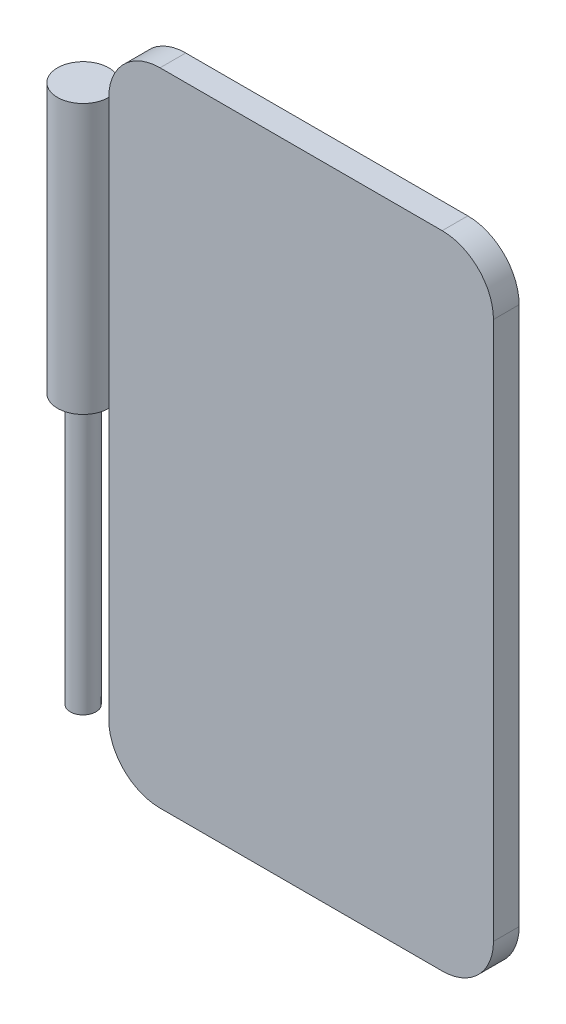
ISO-10303-21;
HEADER;
FILE_DESCRIPTION(('STEP AP214'),'2;1');
FILE_NAME('part.step','',(''),(''),'','','');
FILE_SCHEMA(('AUTOMOTIVE_DESIGN { 1 0 10303 214 1 1 1 1 }'));
ENDSEC;
DATA;
#1=APPLICATION_CONTEXT('core data for automotive mechanical design processes');
#2=APPLICATION_PROTOCOL_DEFINITION('international standard','automotive_design',2000,#1);
#3=PRODUCT_CONTEXT('',#1,'mechanical');
#4=PRODUCT('Part','Part','',(#3));
#5=PRODUCT_RELATED_PRODUCT_CATEGORY('part','',(#4));
#6=PRODUCT_DEFINITION_FORMATION('','',#4);
#7=PRODUCT_DEFINITION_CONTEXT('part definition',#1,'design');
#8=PRODUCT_DEFINITION('design','',#6,#7);
#9=PRODUCT_DEFINITION_SHAPE('','',#8);
#10=(LENGTH_UNIT() NAMED_UNIT(*) SI_UNIT(.MILLI.,.METRE.));
#11=(NAMED_UNIT(*) PLANE_ANGLE_UNIT() SI_UNIT($,.RADIAN.));
#12=(NAMED_UNIT(*) SI_UNIT($,.STERADIAN.) SOLID_ANGLE_UNIT());
#13=UNCERTAINTY_MEASURE_WITH_UNIT(LENGTH_MEASURE(1.E-05),#10,'distance_accuracy_value','');
#14=(GEOMETRIC_REPRESENTATION_CONTEXT(3) GLOBAL_UNCERTAINTY_ASSIGNED_CONTEXT((#13)) GLOBAL_UNIT_ASSIGNED_CONTEXT((#10,
#11,#12)) REPRESENTATION_CONTEXT('',''));
#15=CARTESIAN_POINT('',(0.,0.,0.));
#16=DIRECTION('',(0.,0.,1.));
#17=DIRECTION('',(1.,0.,0.));
#18=AXIS2_PLACEMENT_3D('',#15,#16,#17);
#19=CARTESIAN_POINT('',(0.,-6.87500000000001,0.5));
#20=DIRECTION('',(0.,1.,0.));
#21=DIRECTION('',(-1.,0.,0.));
#22=AXIS2_PLACEMENT_3D('',#19,#20,#21);
#23=PLANE('',#22);
#24=CARTESIAN_POINT('',(3.75,-6.87500000000001,0.5));
#25=DIRECTION('',(0.,1.,0.));
#26=DIRECTION('',(-1.,0.,0.));
#27=AXIS2_PLACEMENT_3D('',#24,#25,#26);
#28=CIRCLE('',#27,0.5);
#29=CARTESIAN_POINT('',(3.25,-6.87500000000001,0.5));
#30=VERTEX_POINT('',#29);
#31=EDGE_CURVE('E11',#30,#30,#28,.T.);
#32=ORIENTED_EDGE('',*,*,#31,.F.);
#33=EDGE_LOOP('',(#32));
#34=FACE_BOUND('',#33,.T.);
#35=ADVANCED_FACE('F53',(#34),#23,.F.);
#36=CARTESIAN_POINT('',(3.75,14.125,0.5));
#37=DIRECTION('',(0.,1.,0.));
#38=DIRECTION('',(-1.,0.,0.));
#39=AXIS2_PLACEMENT_3D('',#36,#37,#38);
#40=CYLINDRICAL_SURFACE('',#39,0.5);
#41=ORIENTED_EDGE('',*,*,#31,.T.);
#42=EDGE_LOOP('',(#41));
#43=FACE_BOUND('',#42,.T.);
#44=CARTESIAN_POINT('',(3.75,3.62499999999999,0.5));
#45=DIRECTION('',(0.,1.,0.));
#46=DIRECTION('',(-1.,0.,0.));
#47=AXIS2_PLACEMENT_3D('',#44,#45,#46);
#48=CIRCLE('',#47,0.5);
#49=CARTESIAN_POINT('',(3.25,3.62499999999999,0.5));
#50=VERTEX_POINT('',#49);
#51=EDGE_CURVE('E59',#50,#50,#48,.T.);
#52=ORIENTED_EDGE('',*,*,#51,.F.);
#53=EDGE_LOOP('',(#52));
#54=FACE_BOUND('',#53,.T.);
#55=ADVANCED_FACE('F85',(#43,#54),#40,.T.);
#56=CARTESIAN_POINT('',(0.,3.62499999999999,0.5));
#57=DIRECTION('',(0.,1.,0.));
#58=DIRECTION('',(-1.,0.,0.));
#59=AXIS2_PLACEMENT_3D('',#56,#57,#58);
#60=PLANE('',#59);
#61=CARTESIAN_POINT('',(3.75,3.62499999999999,0.5));
#62=DIRECTION('',(0.,1.,0.));
#63=DIRECTION('',(-1.,0.,0.));
#64=AXIS2_PLACEMENT_3D('',#61,#62,#63);
#65=CIRCLE('',#64,0.999999999999998);
#66=CARTESIAN_POINT('',(2.75,3.62499999999999,0.5));
#67=VERTEX_POINT('',#66);
#68=EDGE_CURVE('E63',#67,#67,#65,.T.);
#69=ORIENTED_EDGE('',*,*,#68,.F.);
#70=EDGE_LOOP('',(#69));
#71=FACE_BOUND('',#70,.T.);
#72=ORIENTED_EDGE('',*,*,#51,.T.);
#73=EDGE_LOOP('',(#72));
#74=FACE_BOUND('',#73,.T.);
#75=ADVANCED_FACE('F77',(#71,#74),#60,.F.);
#76=CARTESIAN_POINT('',(3.75,14.125,0.5));
#77=DIRECTION('',(0.,1.,0.));
#78=DIRECTION('',(-1.,0.,0.));
#79=AXIS2_PLACEMENT_3D('',#76,#77,#78);
#80=CYLINDRICAL_SURFACE('',#79,0.999999999999999);
#81=ORIENTED_EDGE('',*,*,#68,.T.);
#82=EDGE_LOOP('',(#81));
#83=FACE_BOUND('',#82,.T.);
#84=CARTESIAN_POINT('',(3.75,14.125,0.5));
#85=DIRECTION('',(0.,1.,0.));
#86=DIRECTION('',(-1.,0.,0.));
#87=AXIS2_PLACEMENT_3D('',#84,#85,#86);
#88=CIRCLE('',#87,1.);
#89=CARTESIAN_POINT('',(2.75,14.125,0.5));
#90=VERTEX_POINT('',#89);
#91=EDGE_CURVE('E67',#90,#90,#88,.T.);
#92=ORIENTED_EDGE('',*,*,#91,.F.);
#93=EDGE_LOOP('',(#92));
#94=FACE_BOUND('',#93,.T.);
#95=ADVANCED_FACE('F75',(#83,#94),#80,.T.);
#96=CARTESIAN_POINT('',(0.,14.125,0.5));
#97=DIRECTION('',(0.,1.,0.));
#98=DIRECTION('',(-1.,0.,0.));
#99=AXIS2_PLACEMENT_3D('',#96,#97,#98);
#100=PLANE('',#99);
#101=ORIENTED_EDGE('',*,*,#91,.T.);
#102=EDGE_LOOP('',(#101));
#103=FACE_BOUND('',#102,.T.);
#104=ADVANCED_FACE('F73',(#103),#100,.T.);
#105=CLOSED_SHELL('',(#35,#55,#75,#95,#104));
#106=MANIFOLD_SOLID_BREP('B2',#105);
#107=CARTESIAN_POINT('',(6.75,-6.87500000000001,0.5));
#108=DIRECTION('',(0.,0.,-1.));
#109=DIRECTION('',(-1.,0.,0.));
#110=AXIS2_PLACEMENT_3D('',#107,#108,#109);
#111=CYLINDRICAL_SURFACE('',#110,2.);
#112=CARTESIAN_POINT('',(6.75,-6.87500000000001,-0.5));
#113=DIRECTION('',(0.,0.,1.));
#114=DIRECTION('',(1.,0.,0.));
#115=AXIS2_PLACEMENT_3D('',#112,#113,#114);
#116=CIRCLE('',#115,2.);
#117=CARTESIAN_POINT('',(4.75,-6.875,-0.5));
#118=VERTEX_POINT('',#117);
#119=CARTESIAN_POINT('',(6.75000000000001,-8.87500000000001,-0.5));
#120=VERTEX_POINT('',#119);
#121=EDGE_CURVE('E241',#118,#120,#116,.T.);
#122=ORIENTED_EDGE('',*,*,#121,.T.);
#123=DIRECTION('',(0.,0.,-1.));
#124=VECTOR('',#123,1.);
#125=CARTESIAN_POINT('',(6.75000000000001,-8.87500000000001,0.5));
#126=LINE('',#125,#124);
#127=CARTESIAN_POINT('',(6.75000000000001,-8.87500000000001,0.5));
#128=VERTEX_POINT('',#127);
#129=EDGE_CURVE('E51',#128,#120,#126,.T.);
#130=ORIENTED_EDGE('',*,*,#129,.F.);
#131=CARTESIAN_POINT('',(6.75,-6.87500000000001,0.5));
#132=DIRECTION('',(0.,0.,1.));
#133=DIRECTION('',(1.,0.,0.));
#134=AXIS2_PLACEMENT_3D('',#131,#132,#133);
#135=CIRCLE('',#134,2.);
#136=CARTESIAN_POINT('',(4.75,-6.875,0.5));
#137=VERTEX_POINT('',#136);
#138=EDGE_CURVE('E263',#137,#128,#135,.T.);
#139=ORIENTED_EDGE('',*,*,#138,.F.);
#140=DIRECTION('',(0.,0.,-1.));
#141=VECTOR('',#140,1.);
#142=CARTESIAN_POINT('',(4.75,-6.875,0.5));
#143=LINE('',#142,#141);
#144=EDGE_CURVE('E237',#137,#118,#143,.T.);
#145=ORIENTED_EDGE('',*,*,#144,.T.);
#146=EDGE_LOOP('',(#122,#130,#139,#145));
#147=FACE_BOUND('',#146,.T.);
#148=ADVANCED_FACE('F140',(#147),#111,.T.);
#149=CARTESIAN_POINT('',(17.75,-8.87500000000001,0.5));
#150=DIRECTION('',(0.,1.,0.));
#151=DIRECTION('',(-1.,0.,0.));
#152=AXIS2_PLACEMENT_3D('',#149,#150,#151);
#153=PLANE('',#152);
#154=DIRECTION('',(1.,0.,0.));
#155=VECTOR('',#154,1.);
#156=CARTESIAN_POINT('',(17.75,-8.87500000000001,-0.5));
#157=LINE('',#156,#155);
#158=CARTESIAN_POINT('',(17.75,-8.87500000000001,-0.5));
#159=VERTEX_POINT('',#158);
#160=EDGE_CURVE('E245',#120,#159,#157,.T.);
#161=ORIENTED_EDGE('',*,*,#160,.T.);
#162=DIRECTION('',(0.,0.,-1.));
#163=VECTOR('',#162,1.);
#164=CARTESIAN_POINT('',(17.75,-8.87500000000001,0.5));
#165=LINE('',#164,#163);
#166=CARTESIAN_POINT('',(17.75,-8.87500000000001,0.5));
#167=VERTEX_POINT('',#166);
#168=EDGE_CURVE('E149',#167,#159,#165,.T.);
#169=ORIENTED_EDGE('',*,*,#168,.F.);
#170=DIRECTION('',(1.,0.,0.));
#171=VECTOR('',#170,1.);
#172=CARTESIAN_POINT('',(17.75,-8.87500000000001,0.5));
#173=LINE('',#172,#171);
#174=EDGE_CURVE('E200',#128,#167,#173,.T.);
#175=ORIENTED_EDGE('',*,*,#174,.F.);
#176=ORIENTED_EDGE('',*,*,#129,.T.);
#177=EDGE_LOOP('',(#161,#169,#175,#176));
#178=FACE_BOUND('',#177,.T.);
#179=ADVANCED_FACE('F309',(#178),#153,.F.);
#180=CARTESIAN_POINT('',(17.75,-6.87500000000001,0.5));
#181=DIRECTION('',(0.,0.,-1.));
#182=DIRECTION('',(-1.,0.,0.));
#183=AXIS2_PLACEMENT_3D('',#180,#181,#182);
#184=CYLINDRICAL_SURFACE('',#183,2.);
#185=CARTESIAN_POINT('',(17.75,-6.87500000000001,-0.5));
#186=DIRECTION('',(0.,0.,1.));
#187=DIRECTION('',(1.,0.,0.));
#188=AXIS2_PLACEMENT_3D('',#185,#186,#187);
#189=CIRCLE('',#188,2.);
#190=CARTESIAN_POINT('',(19.75,-6.875,-0.5));
#191=VERTEX_POINT('',#190);
#192=EDGE_CURVE('E248',#159,#191,#189,.T.);
#193=ORIENTED_EDGE('',*,*,#192,.T.);
#194=DIRECTION('',(0.,0.,-1.));
#195=VECTOR('',#194,1.);
#196=CARTESIAN_POINT('',(19.75,-6.875,0.5));
#197=LINE('',#196,#195);
#198=CARTESIAN_POINT('',(19.75,-6.875,0.5));
#199=VERTEX_POINT('',#198);
#200=EDGE_CURVE('E274',#199,#191,#197,.T.);
#201=ORIENTED_EDGE('',*,*,#200,.F.);
#202=CARTESIAN_POINT('',(17.75,-6.87500000000001,0.5));
#203=DIRECTION('',(0.,0.,1.));
#204=DIRECTION('',(1.,0.,0.));
#205=AXIS2_PLACEMENT_3D('',#202,#203,#204);
#206=CIRCLE('',#205,2.);
#207=EDGE_CURVE('E284',#167,#199,#206,.T.);
#208=ORIENTED_EDGE('',*,*,#207,.F.);
#209=ORIENTED_EDGE('',*,*,#168,.T.);
#210=EDGE_LOOP('',(#193,#201,#208,#209));
#211=FACE_BOUND('',#210,.T.);
#212=ADVANCED_FACE('F282',(#211),#184,.T.);
#213=CARTESIAN_POINT('',(19.75,-6.875,0.5));
#214=DIRECTION('',(-1.,0.,0.));
#215=DIRECTION('',(0.,0.,1.));
#216=AXIS2_PLACEMENT_3D('',#213,#214,#215);
#217=PLANE('',#216);
#218=DIRECTION('',(0.,1.,0.));
#219=VECTOR('',#218,1.);
#220=CARTESIAN_POINT('',(19.75,-6.875,-0.5));
#221=LINE('',#220,#219);
#222=CARTESIAN_POINT('',(19.75,14.125,-0.5));
#223=VERTEX_POINT('',#222);
#224=EDGE_CURVE('E251',#191,#223,#221,.T.);
#225=ORIENTED_EDGE('',*,*,#224,.T.);
#226=DIRECTION('',(0.,0.,-1.));
#227=VECTOR('',#226,1.);
#228=CARTESIAN_POINT('',(19.75,14.125,0.5));
#229=LINE('',#228,#227);
#230=CARTESIAN_POINT('',(19.75,14.125,0.5));
#231=VERTEX_POINT('',#230);
#232=EDGE_CURVE('E270',#231,#223,#229,.T.);
#233=ORIENTED_EDGE('',*,*,#232,.F.);
#234=DIRECTION('',(0.,1.,0.));
#235=VECTOR('',#234,1.);
#236=CARTESIAN_POINT('',(19.75,-6.875,0.5));
#237=LINE('',#236,#235);
#238=EDGE_CURVE('E297',#199,#231,#237,.T.);
#239=ORIENTED_EDGE('',*,*,#238,.F.);
#240=ORIENTED_EDGE('',*,*,#200,.T.);
#241=EDGE_LOOP('',(#225,#233,#239,#240));
#242=FACE_BOUND('',#241,.T.);
#243=ADVANCED_FACE('F292',(#242),#217,.F.);
#244=CARTESIAN_POINT('',(17.75,14.125,0.5));
#245=DIRECTION('',(0.,0.,-1.));
#246=DIRECTION('',(-1.,0.,0.));
#247=AXIS2_PLACEMENT_3D('',#244,#245,#246);
#248=CYLINDRICAL_SURFACE('',#247,2.);
#249=CARTESIAN_POINT('',(17.75,14.125,-0.5));
#250=DIRECTION('',(0.,0.,1.));
#251=DIRECTION('',(1.,0.,0.));
#252=AXIS2_PLACEMENT_3D('',#249,#250,#251);
#253=CIRCLE('',#252,2.);
#254=CARTESIAN_POINT('',(17.75,16.125,-0.5));
#255=VERTEX_POINT('',#254);
#256=EDGE_CURVE('E254',#223,#255,#253,.T.);
#257=ORIENTED_EDGE('',*,*,#256,.T.);
#258=DIRECTION('',(0.,0.,-1.));
#259=VECTOR('',#258,1.);
#260=CARTESIAN_POINT('',(17.75,16.125,0.5));
#261=LINE('',#260,#259);
#262=CARTESIAN_POINT('',(17.75,16.125,0.5));
#263=VERTEX_POINT('',#262);
#264=EDGE_CURVE('E230',#263,#255,#261,.T.);
#265=ORIENTED_EDGE('',*,*,#264,.F.);
#266=CARTESIAN_POINT('',(17.75,14.125,0.5));
#267=DIRECTION('',(0.,0.,1.));
#268=DIRECTION('',(1.,0.,0.));
#269=AXIS2_PLACEMENT_3D('',#266,#267,#268);
#270=CIRCLE('',#269,2.);
#271=EDGE_CURVE('E219',#231,#263,#270,.T.);
#272=ORIENTED_EDGE('',*,*,#271,.F.);
#273=ORIENTED_EDGE('',*,*,#232,.T.);
#274=EDGE_LOOP('',(#257,#265,#272,#273));
#275=FACE_BOUND('',#274,.T.);
#276=ADVANCED_FACE('F295',(#275),#248,.T.);
#277=CARTESIAN_POINT('',(17.75,16.125,0.5));
#278=DIRECTION('',(0.,-1.,0.));
#279=DIRECTION('',(1.,0.,0.));
#280=AXIS2_PLACEMENT_3D('',#277,#278,#279);
#281=PLANE('',#280);
#282=DIRECTION('',(-1.,0.,0.));
#283=VECTOR('',#282,1.);
#284=CARTESIAN_POINT('',(17.75,16.125,-0.5));
#285=LINE('',#284,#283);
#286=CARTESIAN_POINT('',(6.75000000000001,16.125,-0.5));
#287=VERTEX_POINT('',#286);
#288=EDGE_CURVE('E228',#255,#287,#285,.T.);
#289=ORIENTED_EDGE('',*,*,#288,.T.);
#290=DIRECTION('',(0.,0.,-1.));
#291=VECTOR('',#290,1.);
#292=CARTESIAN_POINT('',(6.75000000000001,16.125,0.5));
#293=LINE('',#292,#291);
#294=CARTESIAN_POINT('',(6.75000000000001,16.125,0.5));
#295=VERTEX_POINT('',#294);
#296=EDGE_CURVE('E225',#295,#287,#293,.T.);
#297=ORIENTED_EDGE('',*,*,#296,.F.);
#298=DIRECTION('',(-1.,0.,0.));
#299=VECTOR('',#298,1.);
#300=CARTESIAN_POINT('',(17.75,16.125,0.5));
#301=LINE('',#300,#299);
#302=EDGE_CURVE('E213',#263,#295,#301,.T.);
#303=ORIENTED_EDGE('',*,*,#302,.F.);
#304=ORIENTED_EDGE('',*,*,#264,.T.);
#305=EDGE_LOOP('',(#289,#297,#303,#304));
#306=FACE_BOUND('',#305,.T.);
#307=ADVANCED_FACE('F226',(#306),#281,.F.);
#308=CARTESIAN_POINT('',(6.75,14.125,0.5));
#309=DIRECTION('',(0.,0.,-1.));
#310=DIRECTION('',(-1.,0.,0.));
#311=AXIS2_PLACEMENT_3D('',#308,#309,#310);
#312=CYLINDRICAL_SURFACE('',#311,2.);
#313=CARTESIAN_POINT('',(6.75,14.125,-0.5));
#314=DIRECTION('',(0.,0.,1.));
#315=DIRECTION('',(-1.,0.,0.));
#316=AXIS2_PLACEMENT_3D('',#313,#314,#315);
#317=CIRCLE('',#316,2.);
#318=CARTESIAN_POINT('',(4.75,14.125,-0.5));
#319=VERTEX_POINT('',#318);
#320=EDGE_CURVE('E186',#287,#319,#317,.T.);
#321=ORIENTED_EDGE('',*,*,#320,.T.);
#322=DIRECTION('',(0.,0.,-1.));
#323=VECTOR('',#322,1.);
#324=CARTESIAN_POINT('',(4.75,14.125,0.5));
#325=LINE('',#324,#323);
#326=CARTESIAN_POINT('',(4.75,14.125,0.5));
#327=VERTEX_POINT('',#326);
#328=EDGE_CURVE('E231',#327,#319,#325,.T.);
#329=ORIENTED_EDGE('',*,*,#328,.F.);
#330=CARTESIAN_POINT('',(6.75,14.125,0.5));
#331=DIRECTION('',(0.,0.,1.));
#332=DIRECTION('',(-1.,0.,0.));
#333=AXIS2_PLACEMENT_3D('',#330,#331,#332);
#334=CIRCLE('',#333,2.);
#335=EDGE_CURVE('E217',#295,#327,#334,.T.);
#336=ORIENTED_EDGE('',*,*,#335,.F.);
#337=ORIENTED_EDGE('',*,*,#296,.T.);
#338=EDGE_LOOP('',(#321,#329,#336,#337));
#339=FACE_BOUND('',#338,.T.);
#340=ADVANCED_FACE('F233',(#339),#312,.T.);
#341=CARTESIAN_POINT('',(4.75,-6.875,0.5));
#342=DIRECTION('',(1.,0.,0.));
#343=DIRECTION('',(0.,0.,-1.));
#344=AXIS2_PLACEMENT_3D('',#341,#342,#343);
#345=PLANE('',#344);
#346=DIRECTION('',(0.,-1.,0.));
#347=VECTOR('',#346,1.);
#348=CARTESIAN_POINT('',(4.75,-6.875,-0.5));
#349=LINE('',#348,#347);
#350=EDGE_CURVE('E192',#319,#118,#349,.T.);
#351=ORIENTED_EDGE('',*,*,#350,.T.);
#352=ORIENTED_EDGE('',*,*,#144,.F.);
#353=DIRECTION('',(0.,-1.,0.));
#354=VECTOR('',#353,1.);
#355=CARTESIAN_POINT('',(4.75,-6.875,0.5));
#356=LINE('',#355,#354);
#357=EDGE_CURVE('E157',#327,#137,#356,.T.);
#358=ORIENTED_EDGE('',*,*,#357,.F.);
#359=ORIENTED_EDGE('',*,*,#328,.T.);
#360=EDGE_LOOP('',(#351,#352,#358,#359));
#361=FACE_BOUND('',#360,.T.);
#362=ADVANCED_FACE('F325',(#361),#345,.F.);
#363=CARTESIAN_POINT('',(6.75,-6.87500000000001,0.5));
#364=DIRECTION('',(0.,0.,1.));
#365=DIRECTION('',(1.,0.,0.));
#366=AXIS2_PLACEMENT_3D('',#363,#364,#365);
#367=PLANE('',#366);
#368=ORIENTED_EDGE('',*,*,#138,.T.);
#369=ORIENTED_EDGE('',*,*,#174,.T.);
#370=ORIENTED_EDGE('',*,*,#207,.T.);
#371=ORIENTED_EDGE('',*,*,#238,.T.);
#372=ORIENTED_EDGE('',*,*,#271,.T.);
#373=ORIENTED_EDGE('',*,*,#302,.T.);
#374=ORIENTED_EDGE('',*,*,#335,.T.);
#375=ORIENTED_EDGE('',*,*,#357,.T.);
#376=EDGE_LOOP('',(#368,#369,#370,#371,#372,#373,#374,#375));
#377=FACE_BOUND('',#376,.T.);
#378=ADVANCED_FACE('F215',(#377),#367,.T.);
#379=CARTESIAN_POINT('',(6.75,-6.87500000000001,-0.5));
#380=DIRECTION('',(0.,0.,1.));
#381=DIRECTION('',(1.,0.,0.));
#382=AXIS2_PLACEMENT_3D('',#379,#380,#381);
#383=PLANE('',#382);
#384=ORIENTED_EDGE('',*,*,#121,.F.);
#385=ORIENTED_EDGE('',*,*,#350,.F.);
#386=ORIENTED_EDGE('',*,*,#320,.F.);
#387=ORIENTED_EDGE('',*,*,#288,.F.);
#388=ORIENTED_EDGE('',*,*,#256,.F.);
#389=ORIENTED_EDGE('',*,*,#224,.F.);
#390=ORIENTED_EDGE('',*,*,#192,.F.);
#391=ORIENTED_EDGE('',*,*,#160,.F.);
#392=EDGE_LOOP('',(#384,#385,#386,#387,#388,#389,#390,#391));
#393=FACE_BOUND('',#392,.T.);
#394=ADVANCED_FACE('F288',(#393),#383,.F.);
#395=CLOSED_SHELL('',(#148,#179,#212,#243,#276,#307,#340,#362,#378,#394));
#396=MANIFOLD_SOLID_BREP('B6',#395);
#397=ADVANCED_BREP_SHAPE_REPRESENTATION('',(#18,#106,#396),#14);
#398=SHAPE_DEFINITION_REPRESENTATION(#9,#397);
ENDSEC;
END-ISO-10303-21;
